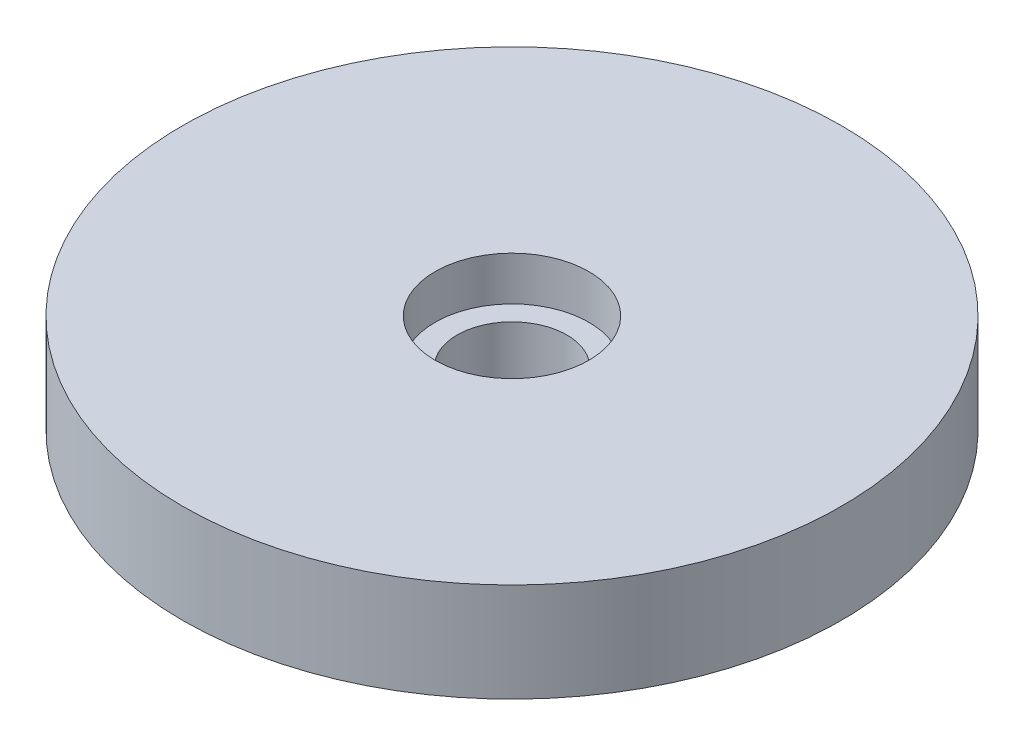
ISO-10303-21;
HEADER;
FILE_DESCRIPTION(('STEP AP214'),'2;1');
FILE_NAME('part.step','',(''),(''),'','','');
FILE_SCHEMA(('AUTOMOTIVE_DESIGN { 1 0 10303 214 1 1 1 1 }'));
ENDSEC;
DATA;
#1=APPLICATION_CONTEXT('core data for automotive mechanical design processes');
#2=APPLICATION_PROTOCOL_DEFINITION('international standard','automotive_design',2000,#1);
#3=PRODUCT_CONTEXT('',#1,'mechanical');
#4=PRODUCT('Part','Part','',(#3));
#5=PRODUCT_RELATED_PRODUCT_CATEGORY('part','',(#4));
#6=PRODUCT_DEFINITION_FORMATION('','',#4);
#7=PRODUCT_DEFINITION_CONTEXT('part definition',#1,'design');
#8=PRODUCT_DEFINITION('design','',#6,#7);
#9=PRODUCT_DEFINITION_SHAPE('','',#8);
#10=(LENGTH_UNIT() NAMED_UNIT(*) SI_UNIT(.MILLI.,.METRE.));
#11=(NAMED_UNIT(*) PLANE_ANGLE_UNIT() SI_UNIT($,.RADIAN.));
#12=(NAMED_UNIT(*) SI_UNIT($,.STERADIAN.) SOLID_ANGLE_UNIT());
#13=UNCERTAINTY_MEASURE_WITH_UNIT(LENGTH_MEASURE(1.E-05),#10,'distance_accuracy_value','');
#14=(GEOMETRIC_REPRESENTATION_CONTEXT(3) GLOBAL_UNCERTAINTY_ASSIGNED_CONTEXT((#13)) GLOBAL_UNIT_ASSIGNED_CONTEXT((#10,
#11,#12)) REPRESENTATION_CONTEXT('',''));
#15=CARTESIAN_POINT('',(0.,0.,0.));
#16=DIRECTION('',(0.,0.,1.));
#17=DIRECTION('',(1.,0.,0.));
#18=AXIS2_PLACEMENT_3D('',#15,#16,#17);
#19=CARTESIAN_POINT('',(0.,6.35,0.));
#20=DIRECTION('',(0.,1.,0.));
#21=DIRECTION('',(0.,0.,1.));
#22=AXIS2_PLACEMENT_3D('',#19,#20,#21);
#23=PLANE('',#22);
#24=CARTESIAN_POINT('',(0.,6.35,0.));
#25=DIRECTION('',(0.,1.,0.));
#26=DIRECTION('',(0.,0.,1.));
#27=AXIS2_PLACEMENT_3D('',#24,#25,#26);
#28=CIRCLE('',#27,6.35);
#29=CARTESIAN_POINT('',(0.,6.35,6.35));
#30=VERTEX_POINT('',#29);
#31=EDGE_CURVE('E58',#30,#30,#28,.T.);
#32=ORIENTED_EDGE('',*,*,#31,.F.);
#33=EDGE_LOOP('',(#32));
#34=FACE_BOUND('',#33,.T.);
#35=CARTESIAN_POINT('',(0.,6.35,0.));
#36=DIRECTION('',(0.,1.,0.));
#37=DIRECTION('',(0.,0.,1.));
#38=AXIS2_PLACEMENT_3D('',#35,#36,#37);
#39=CIRCLE('',#38,8.89);
#40=CARTESIAN_POINT('',(0.,6.35,8.89));
#41=VERTEX_POINT('',#40);
#42=EDGE_CURVE('E272',#41,#41,#39,.T.);
#43=ORIENTED_EDGE('',*,*,#42,.T.);
#44=EDGE_LOOP('',(#43));
#45=FACE_BOUND('',#44,.T.);
#46=ADVANCED_FACE('F39',(#34,#45),#23,.T.);
#47=CARTESIAN_POINT('',(0.,0.,0.));
#48=DIRECTION('',(0.,1.,0.));
#49=DIRECTION('',(0.,0.,1.));
#50=AXIS2_PLACEMENT_3D('',#47,#48,#49);
#51=PLANE('',#50);
#52=CARTESIAN_POINT('',(0.,0.,0.));
#53=DIRECTION('',(0.,1.,0.));
#54=DIRECTION('',(0.,0.,1.));
#55=AXIS2_PLACEMENT_3D('',#52,#53,#54);
#56=CIRCLE('',#55,6.35);
#57=CARTESIAN_POINT('',(0.,0.,6.35));
#58=VERTEX_POINT('',#57);
#59=EDGE_CURVE('E68',#58,#58,#56,.T.);
#60=ORIENTED_EDGE('',*,*,#59,.T.);
#61=EDGE_LOOP('',(#60));
#62=FACE_BOUND('',#61,.T.);
#63=CARTESIAN_POINT('',(0.,0.,31.2664037264377));
#64=DIRECTION('',(0.,-1.,0.));
#65=DIRECTION('',(0.,0.,-1.));
#66=AXIS2_PLACEMENT_3D('',#63,#64,#65);
#67=CIRCLE('',#66,3.81);
#68=CARTESIAN_POINT('',(0.,0.,27.4564037264377));
#69=VERTEX_POINT('',#68);
#70=EDGE_CURVE('E50',#69,#69,#67,.T.);
#71=ORIENTED_EDGE('',*,*,#70,.F.);
#72=EDGE_LOOP('',(#71));
#73=FACE_BOUND('',#72,.T.);
#74=CARTESIAN_POINT('',(-26.9548520361455,0.,15.7040126474025));
#75=DIRECTION('',(0.,-1.,0.));
#76=DIRECTION('',(0.,0.,-1.));
#77=AXIS2_PLACEMENT_3D('',#74,#75,#76);
#78=CIRCLE('',#77,3.81);
#79=CARTESIAN_POINT('',(-26.9548520361455,0.,11.8940126474025));
#80=VERTEX_POINT('',#79);
#81=EDGE_CURVE('E61',#80,#80,#78,.T.);
#82=ORIENTED_EDGE('',*,*,#81,.F.);
#83=EDGE_LOOP('',(#82));
#84=FACE_BOUND('',#83,.T.);
#85=CARTESIAN_POINT('',(-26.9548520361455,0.,-15.4207695106678));
#86=DIRECTION('',(0.,-1.,0.));
#87=DIRECTION('',(0.,0.,-1.));
#88=AXIS2_PLACEMENT_3D('',#85,#86,#87);
#89=CIRCLE('',#88,3.81);
#90=CARTESIAN_POINT('',(-26.9548520361455,0.,-19.2307695106678));
#91=VERTEX_POINT('',#90);
#92=EDGE_CURVE('E86',#91,#91,#89,.T.);
#93=ORIENTED_EDGE('',*,*,#92,.F.);
#94=EDGE_LOOP('',(#93));
#95=FACE_BOUND('',#94,.T.);
#96=CARTESIAN_POINT('',(0.,0.,-30.9831605897029));
#97=DIRECTION('',(0.,-1.,0.));
#98=DIRECTION('',(0.,0.,-1.));
#99=AXIS2_PLACEMENT_3D('',#96,#97,#98);
#100=CIRCLE('',#99,3.81);
#101=CARTESIAN_POINT('',(0.,0.,-34.7931605897029));
#102=VERTEX_POINT('',#101);
#103=EDGE_CURVE('E80',#102,#102,#100,.T.);
#104=ORIENTED_EDGE('',*,*,#103,.F.);
#105=EDGE_LOOP('',(#104));
#106=FACE_BOUND('',#105,.T.);
#107=CARTESIAN_POINT('',(26.9548520361455,0.,-15.4207695106678));
#108=DIRECTION('',(0.,-1.,0.));
#109=DIRECTION('',(0.,0.,-1.));
#110=AXIS2_PLACEMENT_3D('',#107,#108,#109);
#111=CIRCLE('',#110,3.81);
#112=CARTESIAN_POINT('',(26.9548520361455,0.,-19.2307695106678));
#113=VERTEX_POINT('',#112);
#114=EDGE_CURVE('E74',#113,#113,#111,.T.);
#115=ORIENTED_EDGE('',*,*,#114,.F.);
#116=EDGE_LOOP('',(#115));
#117=FACE_BOUND('',#116,.T.);
#118=CARTESIAN_POINT('',(26.9548520361455,0.,15.7040126474025));
#119=DIRECTION('',(0.,-1.,0.));
#120=DIRECTION('',(0.,0.,-1.));
#121=AXIS2_PLACEMENT_3D('',#118,#119,#120);
#122=CIRCLE('',#121,3.81);
#123=CARTESIAN_POINT('',(26.9548520361455,0.,11.8940126474025));
#124=VERTEX_POINT('',#123);
#125=EDGE_CURVE('E55',#124,#124,#122,.T.);
#126=ORIENTED_EDGE('',*,*,#125,.F.);
#127=EDGE_LOOP('',(#126));
#128=FACE_BOUND('',#127,.T.);
#129=CARTESIAN_POINT('',(0.,0.,0.));
#130=DIRECTION('',(0.,1.,0.));
#131=DIRECTION('',(0.,0.,1.));
#132=AXIS2_PLACEMENT_3D('',#129,#130,#131);
#133=CIRCLE('',#132,38.1);
#134=CARTESIAN_POINT('',(0.,0.,38.1));
#135=VERTEX_POINT('',#134);
#136=EDGE_CURVE('E10',#135,#135,#133,.T.);
#137=ORIENTED_EDGE('',*,*,#136,.F.);
#138=EDGE_LOOP('',(#137));
#139=FACE_BOUND('',#138,.T.);
#140=ADVANCED_FACE('F100',(#62,#73,#84,#95,#106,#117,#128,#139),#51,.F.);
#141=CARTESIAN_POINT('',(0.,6.35,0.));
#142=DIRECTION('',(0.,-1.,0.));
#143=DIRECTION('',(0.,0.,-1.));
#144=AXIS2_PLACEMENT_3D('',#141,#142,#143);
#145=CYLINDRICAL_SURFACE('',#144,38.1);
#146=ORIENTED_EDGE('',*,*,#136,.T.);
#147=EDGE_LOOP('',(#146));
#148=FACE_BOUND('',#147,.T.);
#149=CARTESIAN_POINT('',(0.,11.43,0.));
#150=DIRECTION('',(0.,1.,0.));
#151=DIRECTION('',(0.,0.,1.));
#152=AXIS2_PLACEMENT_3D('',#149,#150,#151);
#153=CIRCLE('',#152,38.1);
#154=CARTESIAN_POINT('',(0.,11.43,38.1));
#155=VERTEX_POINT('',#154);
#156=EDGE_CURVE('E274',#155,#155,#153,.T.);
#157=ORIENTED_EDGE('',*,*,#156,.F.);
#158=EDGE_LOOP('',(#157));
#159=FACE_BOUND('',#158,.T.);
#160=ADVANCED_FACE('F41',(#148,#159),#145,.T.);
#161=CARTESIAN_POINT('',(26.9548520361455,2.54,15.7040126474025));
#162=DIRECTION('',(0.,-1.,0.));
#163=DIRECTION('',(0.,0.,-1.));
#164=AXIS2_PLACEMENT_3D('',#161,#162,#163);
#165=CYLINDRICAL_SURFACE('',#164,3.81);
#166=CARTESIAN_POINT('',(26.9548520361455,2.54,15.7040126474025));
#167=DIRECTION('',(0.,-1.,0.));
#168=DIRECTION('',(0.,0.,-1.));
#169=AXIS2_PLACEMENT_3D('',#166,#167,#168);
#170=CIRCLE('',#169,3.81);
#171=CARTESIAN_POINT('',(26.9548520361455,2.54,11.8940126474025));
#172=VERTEX_POINT('',#171);
#173=EDGE_CURVE('E71',#172,#172,#170,.T.);
#174=ORIENTED_EDGE('',*,*,#173,.F.);
#175=EDGE_LOOP('',(#174));
#176=FACE_BOUND('',#175,.T.);
#177=ORIENTED_EDGE('',*,*,#125,.T.);
#178=EDGE_LOOP('',(#177));
#179=FACE_BOUND('',#178,.T.);
#180=ADVANCED_FACE('F111',(#176,#179),#165,.F.);
#181=CARTESIAN_POINT('',(26.9548520361455,2.54,15.7040126474025));
#182=DIRECTION('',(0.,-1.,0.));
#183=DIRECTION('',(0.,0.,-1.));
#184=AXIS2_PLACEMENT_3D('',#181,#182,#183);
#185=PLANE('',#184);
#186=ORIENTED_EDGE('',*,*,#173,.T.);
#187=EDGE_LOOP('',(#186));
#188=FACE_BOUND('',#187,.T.);
#189=ADVANCED_FACE('F113',(#188),#185,.T.);
#190=CARTESIAN_POINT('',(26.9548520361455,2.54,-15.4207695106678));
#191=DIRECTION('',(0.,-1.,0.));
#192=DIRECTION('',(0.,0.,-1.));
#193=AXIS2_PLACEMENT_3D('',#190,#191,#192);
#194=CYLINDRICAL_SURFACE('',#193,3.81);
#195=CARTESIAN_POINT('',(26.9548520361455,2.54,-15.4207695106678));
#196=DIRECTION('',(0.,-1.,0.));
#197=DIRECTION('',(0.,0.,-1.));
#198=AXIS2_PLACEMENT_3D('',#195,#196,#197);
#199=CIRCLE('',#198,3.81);
#200=CARTESIAN_POINT('',(26.9548520361455,2.54,-19.2307695106678));
#201=VERTEX_POINT('',#200);
#202=EDGE_CURVE('E77',#201,#201,#199,.T.);
#203=ORIENTED_EDGE('',*,*,#202,.F.);
#204=EDGE_LOOP('',(#203));
#205=FACE_BOUND('',#204,.T.);
#206=ORIENTED_EDGE('',*,*,#114,.T.);
#207=EDGE_LOOP('',(#206));
#208=FACE_BOUND('',#207,.T.);
#209=ADVANCED_FACE('F119',(#205,#208),#194,.F.);
#210=CARTESIAN_POINT('',(26.9548520361455,2.54,-15.4207695106678));
#211=DIRECTION('',(0.,-1.,0.));
#212=DIRECTION('',(0.,0.,-1.));
#213=AXIS2_PLACEMENT_3D('',#210,#211,#212);
#214=PLANE('',#213);
#215=ORIENTED_EDGE('',*,*,#202,.T.);
#216=EDGE_LOOP('',(#215));
#217=FACE_BOUND('',#216,.T.);
#218=ADVANCED_FACE('F143',(#217),#214,.T.);
#219=CARTESIAN_POINT('',(0.,2.54,-30.9831605897029));
#220=DIRECTION('',(0.,-1.,0.));
#221=DIRECTION('',(0.,0.,-1.));
#222=AXIS2_PLACEMENT_3D('',#219,#220,#221);
#223=CYLINDRICAL_SURFACE('',#222,3.81);
#224=CARTESIAN_POINT('',(0.,2.54,-30.9831605897029));
#225=DIRECTION('',(0.,-1.,0.));
#226=DIRECTION('',(0.,0.,-1.));
#227=AXIS2_PLACEMENT_3D('',#224,#225,#226);
#228=CIRCLE('',#227,3.81);
#229=CARTESIAN_POINT('',(0.,2.54,-34.7931605897029));
#230=VERTEX_POINT('',#229);
#231=EDGE_CURVE('E83',#230,#230,#228,.T.);
#232=ORIENTED_EDGE('',*,*,#231,.F.);
#233=EDGE_LOOP('',(#232));
#234=FACE_BOUND('',#233,.T.);
#235=ORIENTED_EDGE('',*,*,#103,.T.);
#236=EDGE_LOOP('',(#235));
#237=FACE_BOUND('',#236,.T.);
#238=ADVANCED_FACE('F139',(#234,#237),#223,.F.);
#239=CARTESIAN_POINT('',(0.,2.54,-30.9831605897029));
#240=DIRECTION('',(0.,-1.,0.));
#241=DIRECTION('',(0.,0.,-1.));
#242=AXIS2_PLACEMENT_3D('',#239,#240,#241);
#243=PLANE('',#242);
#244=ORIENTED_EDGE('',*,*,#231,.T.);
#245=EDGE_LOOP('',(#244));
#246=FACE_BOUND('',#245,.T.);
#247=ADVANCED_FACE('F96',(#246),#243,.T.);
#248=CARTESIAN_POINT('',(-26.9548520361455,2.54,-15.4207695106678));
#249=DIRECTION('',(0.,-1.,0.));
#250=DIRECTION('',(0.,0.,-1.));
#251=AXIS2_PLACEMENT_3D('',#248,#249,#250);
#252=CYLINDRICAL_SURFACE('',#251,3.81);
#253=CARTESIAN_POINT('',(-26.9548520361455,2.54,-15.4207695106678));
#254=DIRECTION('',(0.,-1.,0.));
#255=DIRECTION('',(0.,0.,-1.));
#256=AXIS2_PLACEMENT_3D('',#253,#254,#255);
#257=CIRCLE('',#256,3.81);
#258=CARTESIAN_POINT('',(-26.9548520361455,2.54,-19.2307695106678));
#259=VERTEX_POINT('',#258);
#260=EDGE_CURVE('E64',#259,#259,#257,.T.);
#261=ORIENTED_EDGE('',*,*,#260,.F.);
#262=EDGE_LOOP('',(#261));
#263=FACE_BOUND('',#262,.T.);
#264=ORIENTED_EDGE('',*,*,#92,.T.);
#265=EDGE_LOOP('',(#264));
#266=FACE_BOUND('',#265,.T.);
#267=ADVANCED_FACE('F93',(#263,#266),#252,.F.);
#268=CARTESIAN_POINT('',(-26.9548520361455,2.54,-15.4207695106678));
#269=DIRECTION('',(0.,-1.,0.));
#270=DIRECTION('',(0.,0.,-1.));
#271=AXIS2_PLACEMENT_3D('',#268,#269,#270);
#272=PLANE('',#271);
#273=ORIENTED_EDGE('',*,*,#260,.T.);
#274=EDGE_LOOP('',(#273));
#275=FACE_BOUND('',#274,.T.);
#276=ADVANCED_FACE('F91',(#275),#272,.T.);
#277=CARTESIAN_POINT('',(-26.9548520361455,2.54,15.7040126474025));
#278=DIRECTION('',(0.,-1.,0.));
#279=DIRECTION('',(0.,0.,-1.));
#280=AXIS2_PLACEMENT_3D('',#277,#278,#279);
#281=CYLINDRICAL_SURFACE('',#280,3.81);
#282=CARTESIAN_POINT('',(-26.9548520361455,2.54,15.7040126474025));
#283=DIRECTION('',(0.,-1.,0.));
#284=DIRECTION('',(0.,0.,-1.));
#285=AXIS2_PLACEMENT_3D('',#282,#283,#284);
#286=CIRCLE('',#285,3.81);
#287=CARTESIAN_POINT('',(-26.9548520361455,2.54,11.8940126474025));
#288=VERTEX_POINT('',#287);
#289=EDGE_CURVE('E65',#288,#288,#286,.T.);
#290=ORIENTED_EDGE('',*,*,#289,.F.);
#291=EDGE_LOOP('',(#290));
#292=FACE_BOUND('',#291,.T.);
#293=ORIENTED_EDGE('',*,*,#81,.T.);
#294=EDGE_LOOP('',(#293));
#295=FACE_BOUND('',#294,.T.);
#296=ADVANCED_FACE('F135',(#292,#295),#281,.F.);
#297=CARTESIAN_POINT('',(-26.9548520361455,2.54,15.7040126474025));
#298=DIRECTION('',(0.,-1.,0.));
#299=DIRECTION('',(0.,0.,-1.));
#300=AXIS2_PLACEMENT_3D('',#297,#298,#299);
#301=PLANE('',#300);
#302=ORIENTED_EDGE('',*,*,#289,.T.);
#303=EDGE_LOOP('',(#302));
#304=FACE_BOUND('',#303,.T.);
#305=ADVANCED_FACE('F188',(#304),#301,.T.);
#306=CARTESIAN_POINT('',(0.,2.54,31.2664037264377));
#307=DIRECTION('',(0.,-1.,0.));
#308=DIRECTION('',(0.,0.,-1.));
#309=AXIS2_PLACEMENT_3D('',#306,#307,#308);
#310=CYLINDRICAL_SURFACE('',#309,3.81);
#311=CARTESIAN_POINT('',(0.,2.54,31.2664037264377));
#312=DIRECTION('',(0.,-1.,0.));
#313=DIRECTION('',(0.,0.,-1.));
#314=AXIS2_PLACEMENT_3D('',#311,#312,#313);
#315=CIRCLE('',#314,3.81);
#316=CARTESIAN_POINT('',(0.,2.54,27.4564037264377));
#317=VERTEX_POINT('',#316);
#318=EDGE_CURVE('E46',#317,#317,#315,.T.);
#319=ORIENTED_EDGE('',*,*,#318,.F.);
#320=EDGE_LOOP('',(#319));
#321=FACE_BOUND('',#320,.T.);
#322=ORIENTED_EDGE('',*,*,#70,.T.);
#323=EDGE_LOOP('',(#322));
#324=FACE_BOUND('',#323,.T.);
#325=ADVANCED_FACE('F197',(#321,#324),#310,.F.);
#326=CARTESIAN_POINT('',(0.,2.54,31.2664037264377));
#327=DIRECTION('',(0.,-1.,0.));
#328=DIRECTION('',(0.,0.,-1.));
#329=AXIS2_PLACEMENT_3D('',#326,#327,#328);
#330=PLANE('',#329);
#331=ORIENTED_EDGE('',*,*,#318,.T.);
#332=EDGE_LOOP('',(#331));
#333=FACE_BOUND('',#332,.T.);
#334=ADVANCED_FACE('F205',(#333),#330,.T.);
#335=CARTESIAN_POINT('',(0.,0.,0.));
#336=DIRECTION('',(0.,1.,0.));
#337=DIRECTION('',(0.,0.,1.));
#338=AXIS2_PLACEMENT_3D('',#335,#336,#337);
#339=CYLINDRICAL_SURFACE('',#338,6.35);
#340=ORIENTED_EDGE('',*,*,#59,.F.);
#341=EDGE_LOOP('',(#340));
#342=FACE_BOUND('',#341,.T.);
#343=ORIENTED_EDGE('',*,*,#31,.T.);
#344=EDGE_LOOP('',(#343));
#345=FACE_BOUND('',#344,.T.);
#346=ADVANCED_FACE('F213',(#342,#345),#339,.F.);
#347=CARTESIAN_POINT('',(0.,11.43,0.));
#348=DIRECTION('',(0.,1.,0.));
#349=DIRECTION('',(0.,0.,1.));
#350=AXIS2_PLACEMENT_3D('',#347,#348,#349);
#351=PLANE('',#350);
#352=ORIENTED_EDGE('',*,*,#156,.T.);
#353=EDGE_LOOP('',(#352));
#354=FACE_BOUND('',#353,.T.);
#355=CARTESIAN_POINT('',(0.,11.43,0.));
#356=DIRECTION('',(0.,1.,0.));
#357=DIRECTION('',(0.,0.,1.));
#358=AXIS2_PLACEMENT_3D('',#355,#356,#357);
#359=CIRCLE('',#358,8.89);
#360=CARTESIAN_POINT('',(0.,11.43,8.89));
#361=VERTEX_POINT('',#360);
#362=EDGE_CURVE('E269',#361,#361,#359,.T.);
#363=ORIENTED_EDGE('',*,*,#362,.F.);
#364=EDGE_LOOP('',(#363));
#365=FACE_BOUND('',#364,.T.);
#366=ADVANCED_FACE('F226',(#354,#365),#351,.T.);
#367=CARTESIAN_POINT('',(0.,11.43,0.));
#368=DIRECTION('',(0.,-1.,0.));
#369=DIRECTION('',(0.,0.,-1.));
#370=AXIS2_PLACEMENT_3D('',#367,#368,#369);
#371=CYLINDRICAL_SURFACE('',#370,8.89);
#372=ORIENTED_EDGE('',*,*,#362,.T.);
#373=EDGE_LOOP('',(#372));
#374=FACE_BOUND('',#373,.T.);
#375=ORIENTED_EDGE('',*,*,#42,.F.);
#376=EDGE_LOOP('',(#375));
#377=FACE_BOUND('',#376,.T.);
#378=ADVANCED_FACE('F253',(#374,#377),#371,.F.);
#379=CLOSED_SHELL('',(#46,#140,#160,#180,#189,#209,#218,#238,#247,#267,#276,#296,#305,#325,#334,
#346,#366,#378));
#380=MANIFOLD_SOLID_BREP('B2',#379);
#381=ADVANCED_BREP_SHAPE_REPRESENTATION('',(#18,#380),#14);
#382=SHAPE_DEFINITION_REPRESENTATION(#9,#381);
ENDSEC;
END-ISO-10303-21;
